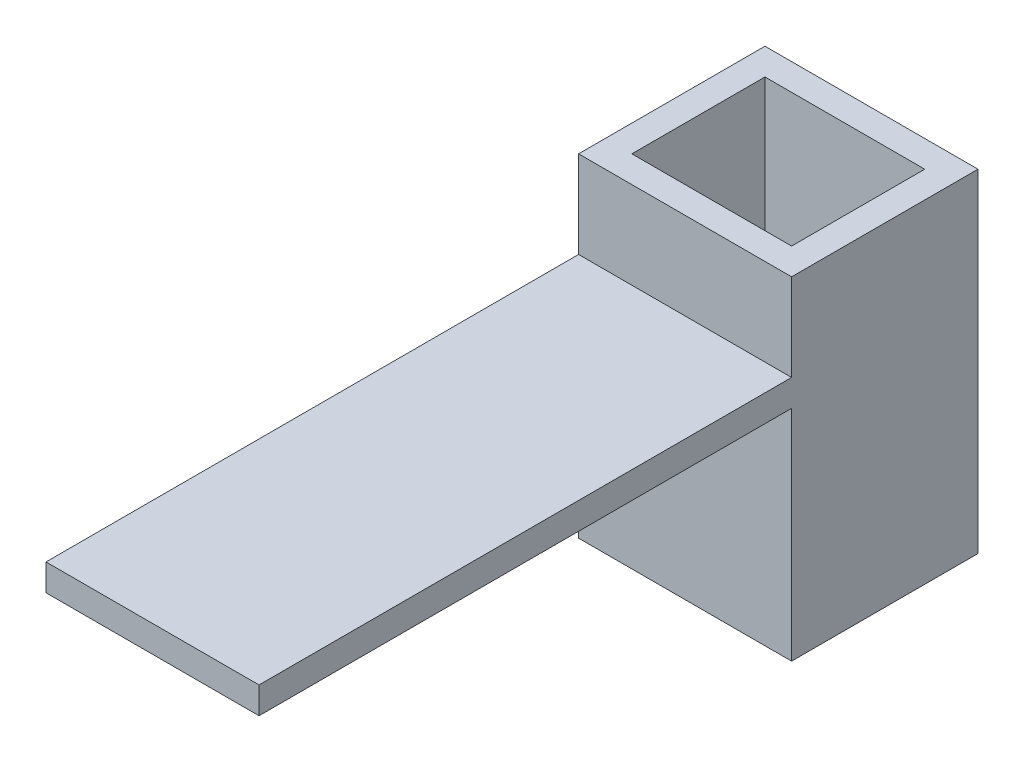
ISO-10303-21;
HEADER;
FILE_DESCRIPTION(('STEP AP214'),'2;1');
FILE_NAME('part.step','',(''),(''),'','','');
FILE_SCHEMA(('AUTOMOTIVE_DESIGN { 1 0 10303 214 1 1 1 1 }'));
ENDSEC;
DATA;
#1=APPLICATION_CONTEXT('core data for automotive mechanical design processes');
#2=APPLICATION_PROTOCOL_DEFINITION('international standard','automotive_design',2000,#1);
#3=PRODUCT_CONTEXT('',#1,'mechanical');
#4=PRODUCT('Part','Part','',(#3));
#5=PRODUCT_RELATED_PRODUCT_CATEGORY('part','',(#4));
#6=PRODUCT_DEFINITION_FORMATION('','',#4);
#7=PRODUCT_DEFINITION_CONTEXT('part definition',#1,'design');
#8=PRODUCT_DEFINITION('design','',#6,#7);
#9=PRODUCT_DEFINITION_SHAPE('','',#8);
#10=(LENGTH_UNIT() NAMED_UNIT(*) SI_UNIT(.MILLI.,.METRE.));
#11=(NAMED_UNIT(*) PLANE_ANGLE_UNIT() SI_UNIT($,.RADIAN.));
#12=(NAMED_UNIT(*) SI_UNIT($,.STERADIAN.) SOLID_ANGLE_UNIT());
#13=UNCERTAINTY_MEASURE_WITH_UNIT(LENGTH_MEASURE(1.E-05),#10,'distance_accuracy_value','');
#14=(GEOMETRIC_REPRESENTATION_CONTEXT(3) GLOBAL_UNCERTAINTY_ASSIGNED_CONTEXT((#13)) GLOBAL_UNIT_ASSIGNED_CONTEXT((#10,
#11,#12)) REPRESENTATION_CONTEXT('',''));
#15=CARTESIAN_POINT('',(0.,0.,0.));
#16=DIRECTION('',(0.,0.,1.));
#17=DIRECTION('',(1.,0.,0.));
#18=AXIS2_PLACEMENT_3D('',#15,#16,#17);
#19=CARTESIAN_POINT('',(0.,25.,12.));
#20=DIRECTION('',(0.,0.,-1.));
#21=DIRECTION('',(-1.,0.,0.));
#22=AXIS2_PLACEMENT_3D('',#19,#20,#21);
#23=PLANE('',#22);
#24=DIRECTION('',(-1.,0.,0.));
#25=VECTOR('',#24,1.);
#26=CARTESIAN_POINT('',(-2.,18.4544482127649,12.));
#27=LINE('',#26,#25);
#28=CARTESIAN_POINT('',(14.,18.4544482127649,12.));
#29=VERTEX_POINT('',#28);
#30=CARTESIAN_POINT('',(-2.,18.4544482127649,12.));
#31=VERTEX_POINT('',#30);
#32=EDGE_CURVE('E147',#29,#31,#27,.T.);
#33=ORIENTED_EDGE('',*,*,#32,.F.);
#34=DIRECTION('',(0.,-1.,0.));
#35=VECTOR('',#34,1.);
#36=CARTESIAN_POINT('',(14.,25.,12.));
#37=LINE('',#36,#35);
#38=CARTESIAN_POINT('',(14.,25.,12.));
#39=VERTEX_POINT('',#38);
#40=EDGE_CURVE('E192',#39,#29,#37,.T.);
#41=ORIENTED_EDGE('',*,*,#40,.F.);
#42=DIRECTION('',(1.,0.,0.));
#43=VECTOR('',#42,1.);
#44=CARTESIAN_POINT('',(0.,25.,12.));
#45=LINE('',#44,#43);
#46=CARTESIAN_POINT('',(-2.,25.,12.));
#47=VERTEX_POINT('',#46);
#48=EDGE_CURVE('E209',#47,#39,#45,.T.);
#49=ORIENTED_EDGE('',*,*,#48,.F.);
#50=DIRECTION('',(0.,-1.,0.));
#51=VECTOR('',#50,1.);
#52=CARTESIAN_POINT('',(-2.,25.,12.));
#53=LINE('',#52,#51);
#54=EDGE_CURVE('E11',#47,#31,#53,.T.);
#55=ORIENTED_EDGE('',*,*,#54,.T.);
#56=EDGE_LOOP('',(#33,#41,#49,#55));
#57=FACE_BOUND('',#56,.T.);
#58=ADVANCED_FACE('F39',(#57),#23,.F.);
#59=DIRECTION('',(1.,0.,0.));
#60=VECTOR('',#59,1.);
#61=CARTESIAN_POINT('',(-2.,16.4469485296041,12.));
#62=LINE('',#61,#60);
#63=CARTESIAN_POINT('',(-2.,16.4469485296041,12.));
#64=VERTEX_POINT('',#63);
#65=CARTESIAN_POINT('',(14.,16.4469485296041,12.));
#66=VERTEX_POINT('',#65);
#67=EDGE_CURVE('E56',#64,#66,#62,.T.);
#68=ORIENTED_EDGE('',*,*,#67,.F.);
#69=CARTESIAN_POINT('',(-2.,0.,12.));
#70=VERTEX_POINT('',#69);
#71=EDGE_CURVE('E48',#64,#70,#53,.T.);
#72=ORIENTED_EDGE('',*,*,#71,.T.);
#73=DIRECTION('',(1.,0.,0.));
#74=VECTOR('',#73,1.);
#75=CARTESIAN_POINT('',(0.,0.,12.));
#76=LINE('',#75,#74);
#77=CARTESIAN_POINT('',(14.,0.,12.));
#78=VERTEX_POINT('',#77);
#79=EDGE_CURVE('E199',#70,#78,#76,.T.);
#80=ORIENTED_EDGE('',*,*,#79,.T.);
#81=EDGE_CURVE('E195',#66,#78,#37,.T.);
#82=ORIENTED_EDGE('',*,*,#81,.F.);
#83=EDGE_LOOP('',(#68,#72,#80,#82));
#84=FACE_BOUND('',#83,.T.);
#85=ADVANCED_FACE('F244',(#84),#23,.F.);
#86=CARTESIAN_POINT('',(-2.,25.,0.));
#87=DIRECTION('',(1.,0.,0.));
#88=DIRECTION('',(0.,0.,-1.));
#89=AXIS2_PLACEMENT_3D('',#86,#87,#88);
#90=PLANE('',#89);
#91=DIRECTION('',(0.,0.,1.));
#92=VECTOR('',#91,1.);
#93=CARTESIAN_POINT('',(-2.,0.,0.));
#94=LINE('',#93,#92);
#95=CARTESIAN_POINT('',(-2.,0.,-2.));
#96=VERTEX_POINT('',#95);
#97=EDGE_CURVE('E186',#96,#70,#94,.T.);
#98=ORIENTED_EDGE('',*,*,#97,.T.);
#99=ORIENTED_EDGE('',*,*,#71,.F.);
#100=DIRECTION('',(0.,0.,-1.));
#101=VECTOR('',#100,1.);
#102=CARTESIAN_POINT('',(-2.,16.4469485296041,52.));
#103=LINE('',#102,#101);
#104=CARTESIAN_POINT('',(-2.,16.4469485296041,52.));
#105=VERTEX_POINT('',#104);
#106=EDGE_CURVE('E132',#105,#64,#103,.T.);
#107=ORIENTED_EDGE('',*,*,#106,.F.);
#108=DIRECTION('',(0.,-1.,0.));
#109=VECTOR('',#108,1.);
#110=CARTESIAN_POINT('',(-2.,18.4544482127649,52.));
#111=LINE('',#110,#109);
#112=CARTESIAN_POINT('',(-2.,18.4544482127649,52.));
#113=VERTEX_POINT('',#112);
#114=EDGE_CURVE('E138',#113,#105,#111,.T.);
#115=ORIENTED_EDGE('',*,*,#114,.F.);
#116=DIRECTION('',(0.,0.,-1.));
#117=VECTOR('',#116,1.);
#118=CARTESIAN_POINT('',(-2.,18.4544482127649,52.));
#119=LINE('',#118,#117);
#120=EDGE_CURVE('E221',#113,#31,#119,.T.);
#121=ORIENTED_EDGE('',*,*,#120,.T.);
#122=ORIENTED_EDGE('',*,*,#54,.F.);
#123=DIRECTION('',(0.,0.,1.));
#124=VECTOR('',#123,1.);
#125=CARTESIAN_POINT('',(-2.,25.,0.));
#126=LINE('',#125,#124);
#127=CARTESIAN_POINT('',(-2.,25.,-2.));
#128=VERTEX_POINT('',#127);
#129=EDGE_CURVE('E202',#128,#47,#126,.T.);
#130=ORIENTED_EDGE('',*,*,#129,.F.);
#131=DIRECTION('',(0.,-1.,0.));
#132=VECTOR('',#131,1.);
#133=CARTESIAN_POINT('',(-2.,25.,-2.));
#134=LINE('',#133,#132);
#135=EDGE_CURVE('E188',#128,#96,#134,.T.);
#136=ORIENTED_EDGE('',*,*,#135,.T.);
#137=EDGE_LOOP('',(#98,#99,#107,#115,#121,#122,#130,#136));
#138=FACE_BOUND('',#137,.T.);
#139=ADVANCED_FACE('F150',(#138),#90,.F.);
#140=CARTESIAN_POINT('',(14.,25.,0.));
#141=DIRECTION('',(-1.,0.,0.));
#142=DIRECTION('',(0.,0.,1.));
#143=AXIS2_PLACEMENT_3D('',#140,#141,#142);
#144=PLANE('',#143);
#145=DIRECTION('',(0.,0.,-1.));
#146=VECTOR('',#145,1.);
#147=CARTESIAN_POINT('',(14.,0.,0.));
#148=LINE('',#147,#146);
#149=CARTESIAN_POINT('',(14.,0.,-2.));
#150=VERTEX_POINT('',#149);
#151=EDGE_CURVE('E203',#78,#150,#148,.T.);
#152=ORIENTED_EDGE('',*,*,#151,.T.);
#153=DIRECTION('',(0.,-1.,0.));
#154=VECTOR('',#153,1.);
#155=CARTESIAN_POINT('',(14.,25.,-2.));
#156=LINE('',#155,#154);
#157=CARTESIAN_POINT('',(14.,25.,-2.));
#158=VERTEX_POINT('',#157);
#159=EDGE_CURVE('E191',#158,#150,#156,.T.);
#160=ORIENTED_EDGE('',*,*,#159,.F.);
#161=DIRECTION('',(0.,0.,-1.));
#162=VECTOR('',#161,1.);
#163=CARTESIAN_POINT('',(14.,25.,0.));
#164=LINE('',#163,#162);
#165=EDGE_CURVE('E210',#39,#158,#164,.T.);
#166=ORIENTED_EDGE('',*,*,#165,.F.);
#167=ORIENTED_EDGE('',*,*,#40,.T.);
#168=DIRECTION('',(0.,0.,-1.));
#169=VECTOR('',#168,1.);
#170=CARTESIAN_POINT('',(14.,18.4544482127649,52.));
#171=LINE('',#170,#169);
#172=CARTESIAN_POINT('',(14.,18.4544482127649,52.));
#173=VERTEX_POINT('',#172);
#174=EDGE_CURVE('E156',#173,#29,#171,.T.);
#175=ORIENTED_EDGE('',*,*,#174,.F.);
#176=DIRECTION('',(0.,1.,0.));
#177=VECTOR('',#176,1.);
#178=CARTESIAN_POINT('',(14.,18.4544482127649,52.));
#179=LINE('',#178,#177);
#180=CARTESIAN_POINT('',(14.,16.4469485296041,52.));
#181=VERTEX_POINT('',#180);
#182=EDGE_CURVE('E137',#181,#173,#179,.T.);
#183=ORIENTED_EDGE('',*,*,#182,.F.);
#184=DIRECTION('',(0.,0.,-1.));
#185=VECTOR('',#184,1.);
#186=CARTESIAN_POINT('',(14.,16.4469485296041,52.));
#187=LINE('',#186,#185);
#188=EDGE_CURVE('E134',#181,#66,#187,.T.);
#189=ORIENTED_EDGE('',*,*,#188,.T.);
#190=ORIENTED_EDGE('',*,*,#81,.T.);
#191=EDGE_LOOP('',(#152,#160,#166,#167,#175,#183,#189,#190));
#192=FACE_BOUND('',#191,.T.);
#193=ADVANCED_FACE('F231',(#192),#144,.F.);
#194=CARTESIAN_POINT('',(0.,25.,-2.));
#195=DIRECTION('',(0.,0.,1.));
#196=DIRECTION('',(1.,0.,0.));
#197=AXIS2_PLACEMENT_3D('',#194,#195,#196);
#198=PLANE('',#197);
#199=DIRECTION('',(-1.,0.,0.));
#200=VECTOR('',#199,1.);
#201=CARTESIAN_POINT('',(0.,0.,-2.));
#202=LINE('',#201,#200);
#203=EDGE_CURVE('E200',#150,#96,#202,.T.);
#204=ORIENTED_EDGE('',*,*,#203,.T.);
#205=ORIENTED_EDGE('',*,*,#135,.F.);
#206=DIRECTION('',(-1.,0.,0.));
#207=VECTOR('',#206,1.);
#208=CARTESIAN_POINT('',(0.,25.,-2.));
#209=LINE('',#208,#207);
#210=EDGE_CURVE('E43',#158,#128,#209,.T.);
#211=ORIENTED_EDGE('',*,*,#210,.F.);
#212=ORIENTED_EDGE('',*,*,#159,.T.);
#213=EDGE_LOOP('',(#204,#205,#211,#212));
#214=FACE_BOUND('',#213,.T.);
#215=ADVANCED_FACE('F41',(#214),#198,.F.);
#216=CARTESIAN_POINT('',(0.,25.,0.));
#217=DIRECTION('',(0.,1.,0.));
#218=DIRECTION('',(0.,0.,1.));
#219=AXIS2_PLACEMENT_3D('',#216,#217,#218);
#220=PLANE('',#219);
#221=DIRECTION('',(0.,0.,1.));
#222=VECTOR('',#221,1.);
#223=CARTESIAN_POINT('',(0.,25.,0.));
#224=LINE('',#223,#222);
#225=CARTESIAN_POINT('',(0.,25.,0.));
#226=VERTEX_POINT('',#225);
#227=CARTESIAN_POINT('',(0.,25.,10.));
#228=VERTEX_POINT('',#227);
#229=EDGE_CURVE('E160',#226,#228,#224,.T.);
#230=ORIENTED_EDGE('',*,*,#229,.F.);
#231=DIRECTION('',(-1.,0.,0.));
#232=VECTOR('',#231,1.);
#233=CARTESIAN_POINT('',(0.,25.,0.));
#234=LINE('',#233,#232);
#235=CARTESIAN_POINT('',(12.,25.,0.));
#236=VERTEX_POINT('',#235);
#237=EDGE_CURVE('E168',#236,#226,#234,.T.);
#238=ORIENTED_EDGE('',*,*,#237,.F.);
#239=DIRECTION('',(0.,0.,-1.));
#240=VECTOR('',#239,1.);
#241=CARTESIAN_POINT('',(12.,25.,0.));
#242=LINE('',#241,#240);
#243=CARTESIAN_POINT('',(12.,25.,10.));
#244=VERTEX_POINT('',#243);
#245=EDGE_CURVE('E165',#244,#236,#242,.T.);
#246=ORIENTED_EDGE('',*,*,#245,.F.);
#247=DIRECTION('',(1.,0.,0.));
#248=VECTOR('',#247,1.);
#249=CARTESIAN_POINT('',(0.,25.,10.));
#250=LINE('',#249,#248);
#251=EDGE_CURVE('E162',#228,#244,#250,.T.);
#252=ORIENTED_EDGE('',*,*,#251,.F.);
#253=EDGE_LOOP('',(#230,#238,#246,#252));
#254=FACE_BOUND('',#253,.T.);
#255=ORIENTED_EDGE('',*,*,#129,.T.);
#256=ORIENTED_EDGE('',*,*,#48,.T.);
#257=ORIENTED_EDGE('',*,*,#165,.T.);
#258=ORIENTED_EDGE('',*,*,#210,.T.);
#259=EDGE_LOOP('',(#255,#256,#257,#258));
#260=FACE_BOUND('',#259,.T.);
#261=ADVANCED_FACE('F216',(#254,#260),#220,.T.);
#262=CARTESIAN_POINT('',(0.,0.,0.));
#263=DIRECTION('',(0.,1.,0.));
#264=DIRECTION('',(0.,0.,1.));
#265=AXIS2_PLACEMENT_3D('',#262,#263,#264);
#266=PLANE('',#265);
#267=DIRECTION('',(-1.,0.,0.));
#268=VECTOR('',#267,1.);
#269=CARTESIAN_POINT('',(0.,0.,0.));
#270=LINE('',#269,#268);
#271=CARTESIAN_POINT('',(12.,0.,0.));
#272=VERTEX_POINT('',#271);
#273=CARTESIAN_POINT('',(0.,0.,0.));
#274=VERTEX_POINT('',#273);
#275=EDGE_CURVE('E163',#272,#274,#270,.T.);
#276=ORIENTED_EDGE('',*,*,#275,.T.);
#277=DIRECTION('',(0.,0.,1.));
#278=VECTOR('',#277,1.);
#279=CARTESIAN_POINT('',(0.,0.,0.));
#280=LINE('',#279,#278);
#281=CARTESIAN_POINT('',(0.,0.,10.));
#282=VERTEX_POINT('',#281);
#283=EDGE_CURVE('E151',#274,#282,#280,.T.);
#284=ORIENTED_EDGE('',*,*,#283,.T.);
#285=DIRECTION('',(1.,0.,0.));
#286=VECTOR('',#285,1.);
#287=CARTESIAN_POINT('',(0.,0.,10.));
#288=LINE('',#287,#286);
#289=CARTESIAN_POINT('',(12.,0.,10.));
#290=VERTEX_POINT('',#289);
#291=EDGE_CURVE('E154',#282,#290,#288,.T.);
#292=ORIENTED_EDGE('',*,*,#291,.T.);
#293=DIRECTION('',(0.,0.,-1.));
#294=VECTOR('',#293,1.);
#295=CARTESIAN_POINT('',(12.,0.,0.));
#296=LINE('',#295,#294);
#297=EDGE_CURVE('E173',#290,#272,#296,.T.);
#298=ORIENTED_EDGE('',*,*,#297,.T.);
#299=EDGE_LOOP('',(#276,#284,#292,#298));
#300=FACE_BOUND('',#299,.T.);
#301=ORIENTED_EDGE('',*,*,#97,.F.);
#302=ORIENTED_EDGE('',*,*,#203,.F.);
#303=ORIENTED_EDGE('',*,*,#151,.F.);
#304=ORIENTED_EDGE('',*,*,#79,.F.);
#305=EDGE_LOOP('',(#301,#302,#303,#304));
#306=FACE_BOUND('',#305,.T.);
#307=ADVANCED_FACE('F306',(#300,#306),#266,.F.);
#308=CARTESIAN_POINT('',(0.,25.,0.));
#309=DIRECTION('',(1.,0.,0.));
#310=DIRECTION('',(0.,0.,-1.));
#311=AXIS2_PLACEMENT_3D('',#308,#309,#310);
#312=PLANE('',#311);
#313=ORIENTED_EDGE('',*,*,#283,.F.);
#314=DIRECTION('',(0.,-1.,0.));
#315=VECTOR('',#314,1.);
#316=CARTESIAN_POINT('',(0.,25.,0.));
#317=LINE('',#316,#315);
#318=EDGE_CURVE('E169',#226,#274,#317,.T.);
#319=ORIENTED_EDGE('',*,*,#318,.F.);
#320=ORIENTED_EDGE('',*,*,#229,.T.);
#321=DIRECTION('',(0.,-1.,0.));
#322=VECTOR('',#321,1.);
#323=CARTESIAN_POINT('',(0.,25.,10.));
#324=LINE('',#323,#322);
#325=EDGE_CURVE('E184',#228,#282,#324,.T.);
#326=ORIENTED_EDGE('',*,*,#325,.T.);
#327=EDGE_LOOP('',(#313,#319,#320,#326));
#328=FACE_BOUND('',#327,.T.);
#329=ADVANCED_FACE('F296',(#328),#312,.T.);
#330=CARTESIAN_POINT('',(0.,25.,10.));
#331=DIRECTION('',(0.,0.,-1.));
#332=DIRECTION('',(-1.,0.,0.));
#333=AXIS2_PLACEMENT_3D('',#330,#331,#332);
#334=PLANE('',#333);
#335=ORIENTED_EDGE('',*,*,#291,.F.);
#336=ORIENTED_EDGE('',*,*,#325,.F.);
#337=ORIENTED_EDGE('',*,*,#251,.T.);
#338=DIRECTION('',(0.,-1.,0.));
#339=VECTOR('',#338,1.);
#340=CARTESIAN_POINT('',(12.,25.,10.));
#341=LINE('',#340,#339);
#342=EDGE_CURVE('E181',#244,#290,#341,.T.);
#343=ORIENTED_EDGE('',*,*,#342,.T.);
#344=EDGE_LOOP('',(#335,#336,#337,#343));
#345=FACE_BOUND('',#344,.T.);
#346=ADVANCED_FACE('F286',(#345),#334,.T.);
#347=CARTESIAN_POINT('',(12.,25.,0.));
#348=DIRECTION('',(-1.,0.,0.));
#349=DIRECTION('',(0.,0.,1.));
#350=AXIS2_PLACEMENT_3D('',#347,#348,#349);
#351=PLANE('',#350);
#352=ORIENTED_EDGE('',*,*,#297,.F.);
#353=ORIENTED_EDGE('',*,*,#342,.F.);
#354=ORIENTED_EDGE('',*,*,#245,.T.);
#355=DIRECTION('',(0.,-1.,0.));
#356=VECTOR('',#355,1.);
#357=CARTESIAN_POINT('',(12.,25.,0.));
#358=LINE('',#357,#356);
#359=EDGE_CURVE('E179',#236,#272,#358,.T.);
#360=ORIENTED_EDGE('',*,*,#359,.T.);
#361=EDGE_LOOP('',(#352,#353,#354,#360));
#362=FACE_BOUND('',#361,.T.);
#363=ADVANCED_FACE('F276',(#362),#351,.T.);
#364=CARTESIAN_POINT('',(0.,25.,0.));
#365=DIRECTION('',(0.,0.,1.));
#366=DIRECTION('',(1.,0.,0.));
#367=AXIS2_PLACEMENT_3D('',#364,#365,#366);
#368=PLANE('',#367);
#369=ORIENTED_EDGE('',*,*,#275,.F.);
#370=ORIENTED_EDGE('',*,*,#359,.F.);
#371=ORIENTED_EDGE('',*,*,#237,.T.);
#372=ORIENTED_EDGE('',*,*,#318,.T.);
#373=EDGE_LOOP('',(#369,#370,#371,#372));
#374=FACE_BOUND('',#373,.T.);
#375=ADVANCED_FACE('F241',(#374),#368,.T.);
#376=CARTESIAN_POINT('',(-2.,16.4469485296041,52.));
#377=DIRECTION('',(0.,1.,0.));
#378=DIRECTION('',(0.,0.,1.));
#379=AXIS2_PLACEMENT_3D('',#376,#377,#378);
#380=PLANE('',#379);
#381=ORIENTED_EDGE('',*,*,#67,.T.);
#382=ORIENTED_EDGE('',*,*,#188,.F.);
#383=DIRECTION('',(1.,0.,0.));
#384=VECTOR('',#383,1.);
#385=CARTESIAN_POINT('',(-2.,16.4469485296041,52.));
#386=LINE('',#385,#384);
#387=EDGE_CURVE('E128',#105,#181,#386,.T.);
#388=ORIENTED_EDGE('',*,*,#387,.F.);
#389=ORIENTED_EDGE('',*,*,#106,.T.);
#390=EDGE_LOOP('',(#381,#382,#388,#389));
#391=FACE_BOUND('',#390,.T.);
#392=ADVANCED_FACE('F130',(#391),#380,.F.);
#393=CARTESIAN_POINT('',(-2.,18.4544482127649,52.));
#394=DIRECTION('',(0.,-1.,0.));
#395=DIRECTION('',(0.,0.,-1.));
#396=AXIS2_PLACEMENT_3D('',#393,#394,#395);
#397=PLANE('',#396);
#398=ORIENTED_EDGE('',*,*,#32,.T.);
#399=ORIENTED_EDGE('',*,*,#120,.F.);
#400=DIRECTION('',(-1.,0.,0.));
#401=VECTOR('',#400,1.);
#402=CARTESIAN_POINT('',(-2.,18.4544482127649,52.));
#403=LINE('',#402,#401);
#404=EDGE_CURVE('E143',#173,#113,#403,.T.);
#405=ORIENTED_EDGE('',*,*,#404,.F.);
#406=ORIENTED_EDGE('',*,*,#174,.T.);
#407=EDGE_LOOP('',(#398,#399,#405,#406));
#408=FACE_BOUND('',#407,.T.);
#409=ADVANCED_FACE('F233',(#408),#397,.F.);
#410=CARTESIAN_POINT('',(0.,0.,52.));
#411=DIRECTION('',(0.,0.,1.));
#412=DIRECTION('',(1.,0.,0.));
#413=AXIS2_PLACEMENT_3D('',#410,#411,#412);
#414=PLANE('',#413);
#415=ORIENTED_EDGE('',*,*,#114,.T.);
#416=ORIENTED_EDGE('',*,*,#387,.T.);
#417=ORIENTED_EDGE('',*,*,#182,.T.);
#418=ORIENTED_EDGE('',*,*,#404,.T.);
#419=EDGE_LOOP('',(#415,#416,#417,#418));
#420=FACE_BOUND('',#419,.T.);
#421=ADVANCED_FACE('F141',(#420),#414,.T.);
#422=CLOSED_SHELL('',(#58,#85,#139,#193,#215,#261,#307,#329,#346,#363,#375,#392,#409,#421));
#423=MANIFOLD_SOLID_BREP('B2',#422);
#424=ADVANCED_BREP_SHAPE_REPRESENTATION('',(#18,#423),#14);
#425=SHAPE_DEFINITION_REPRESENTATION(#9,#424);
ENDSEC;
END-ISO-10303-21;
